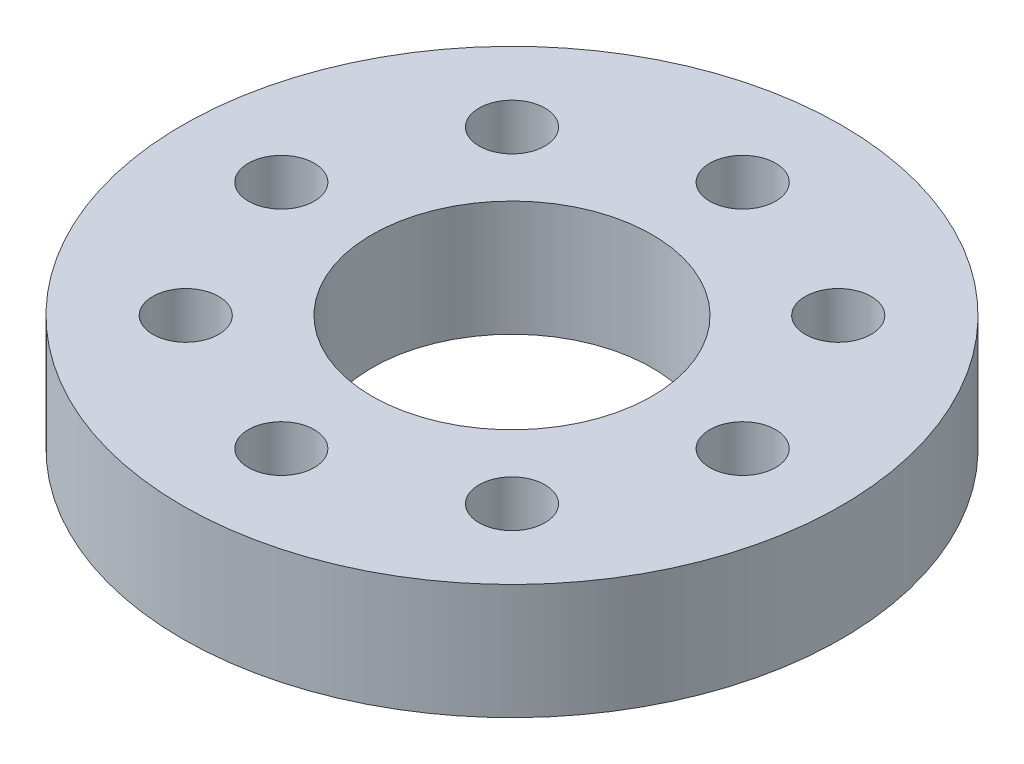
ISO-10303-21;
HEADER;
FILE_DESCRIPTION(('STEP AP214'),'2;1');
FILE_NAME('part.step','',(''),(''),'','','');
FILE_SCHEMA(('AUTOMOTIVE_DESIGN { 1 0 10303 214 1 1 1 1 }'));
ENDSEC;
DATA;
#1=APPLICATION_CONTEXT('core data for automotive mechanical design processes');
#2=APPLICATION_PROTOCOL_DEFINITION('international standard','automotive_design',2000,#1);
#3=PRODUCT_CONTEXT('',#1,'mechanical');
#4=PRODUCT('Part','Part','',(#3));
#5=PRODUCT_RELATED_PRODUCT_CATEGORY('part','',(#4));
#6=PRODUCT_DEFINITION_FORMATION('','',#4);
#7=PRODUCT_DEFINITION_CONTEXT('part definition',#1,'design');
#8=PRODUCT_DEFINITION('design','',#6,#7);
#9=PRODUCT_DEFINITION_SHAPE('','',#8);
#10=(LENGTH_UNIT() NAMED_UNIT(*) SI_UNIT(.MILLI.,.METRE.));
#11=(NAMED_UNIT(*) PLANE_ANGLE_UNIT() SI_UNIT($,.RADIAN.));
#12=(NAMED_UNIT(*) SI_UNIT($,.STERADIAN.) SOLID_ANGLE_UNIT());
#13=UNCERTAINTY_MEASURE_WITH_UNIT(LENGTH_MEASURE(1.E-05),#10,'distance_accuracy_value','');
#14=(GEOMETRIC_REPRESENTATION_CONTEXT(3) GLOBAL_UNCERTAINTY_ASSIGNED_CONTEXT((#13)) GLOBAL_UNIT_ASSIGNED_CONTEXT((#10,
#11,#12)) REPRESENTATION_CONTEXT('',''));
#15=CARTESIAN_POINT('',(0.,0.,0.));
#16=DIRECTION('',(0.,0.,1.));
#17=DIRECTION('',(1.,0.,0.));
#18=AXIS2_PLACEMENT_3D('',#15,#16,#17);
#19=CARTESIAN_POINT('',(0.,3.5,0.));
#20=DIRECTION('',(0.,1.,0.));
#21=DIRECTION('',(0.,0.,1.));
#22=AXIS2_PLACEMENT_3D('',#19,#20,#21);
#23=PLANE('',#22);
#24=CARTESIAN_POINT('',(-7.,3.5,0.));
#25=DIRECTION('',(0.,1.,0.));
#26=DIRECTION('',(0.,0.,1.));
#27=AXIS2_PLACEMENT_3D('',#24,#25,#26);
#28=CIRCLE('',#27,1.00000000000007);
#29=CARTESIAN_POINT('',(-7.,3.5,1.00000000000007));
#30=VERTEX_POINT('',#29);
#31=EDGE_CURVE('E86',#30,#30,#28,.T.);
#32=ORIENTED_EDGE('',*,*,#31,.F.);
#33=EDGE_LOOP('',(#32));
#34=FACE_BOUND('',#33,.T.);
#35=CARTESIAN_POINT('',(0.,3.5,7.));
#36=DIRECTION('',(0.,1.,0.));
#37=DIRECTION('',(0.,0.,1.));
#38=AXIS2_PLACEMENT_3D('',#35,#36,#37);
#39=CIRCLE('',#38,1.00000000000005);
#40=CARTESIAN_POINT('',(0.,3.5,8.00000000000005));
#41=VERTEX_POINT('',#40);
#42=EDGE_CURVE('E74',#41,#41,#39,.T.);
#43=ORIENTED_EDGE('',*,*,#42,.F.);
#44=EDGE_LOOP('',(#43));
#45=FACE_BOUND('',#44,.T.);
#46=CARTESIAN_POINT('',(7.,3.5,0.));
#47=DIRECTION('',(0.,1.,0.));
#48=DIRECTION('',(0.,0.,1.));
#49=AXIS2_PLACEMENT_3D('',#46,#47,#48);
#50=CIRCLE('',#49,1.00000000000002);
#51=CARTESIAN_POINT('',(7.,3.5,1.00000000000002));
#52=VERTEX_POINT('',#51);
#53=EDGE_CURVE('E62',#52,#52,#50,.T.);
#54=ORIENTED_EDGE('',*,*,#53,.F.);
#55=EDGE_LOOP('',(#54));
#56=FACE_BOUND('',#55,.T.);
#57=CARTESIAN_POINT('',(0.,3.5,-7.));
#58=DIRECTION('',(0.,1.,0.));
#59=DIRECTION('',(0.,0.,1.));
#60=AXIS2_PLACEMENT_3D('',#57,#58,#59);
#61=CIRCLE('',#60,1.);
#62=CARTESIAN_POINT('',(0.,3.5,-6.));
#63=VERTEX_POINT('',#62);
#64=EDGE_CURVE('E50',#63,#63,#61,.T.);
#65=ORIENTED_EDGE('',*,*,#64,.F.);
#66=EDGE_LOOP('',(#65));
#67=FACE_BOUND('',#66,.T.);
#68=CARTESIAN_POINT('',(0.,3.5,0.));
#69=DIRECTION('',(0.,1.,0.));
#70=DIRECTION('',(0.,0.,1.));
#71=AXIS2_PLACEMENT_3D('',#68,#69,#70);
#72=CIRCLE('',#71,10.);
#73=CARTESIAN_POINT('',(0.,3.5,10.));
#74=VERTEX_POINT('',#73);
#75=EDGE_CURVE('E10',#74,#74,#72,.T.);
#76=ORIENTED_EDGE('',*,*,#75,.T.);
#77=EDGE_LOOP('',(#76));
#78=FACE_BOUND('',#77,.T.);
#79=CARTESIAN_POINT('',(0.,3.5,0.));
#80=DIRECTION('',(0.,1.,0.));
#81=DIRECTION('',(0.,0.,1.));
#82=AXIS2_PLACEMENT_3D('',#79,#80,#81);
#83=CIRCLE('',#82,4.25);
#84=CARTESIAN_POINT('',(0.,3.5,4.25));
#85=VERTEX_POINT('',#84);
#86=EDGE_CURVE('E45',#85,#85,#83,.T.);
#87=ORIENTED_EDGE('',*,*,#86,.F.);
#88=EDGE_LOOP('',(#87));
#89=FACE_BOUND('',#88,.T.);
#90=CARTESIAN_POINT('',(4.94974746830583,3.5,-4.94974746830583));
#91=DIRECTION('',(0.,1.,0.));
#92=DIRECTION('',(0.,0.,1.));
#93=AXIS2_PLACEMENT_3D('',#90,#91,#92);
#94=CIRCLE('',#93,1.00000000000001);
#95=CARTESIAN_POINT('',(4.94974746830583,3.5,-3.94974746830582));
#96=VERTEX_POINT('',#95);
#97=EDGE_CURVE('E56',#96,#96,#94,.T.);
#98=ORIENTED_EDGE('',*,*,#97,.F.);
#99=EDGE_LOOP('',(#98));
#100=FACE_BOUND('',#99,.T.);
#101=CARTESIAN_POINT('',(4.94974746830583,3.5,4.94974746830583));
#102=DIRECTION('',(0.,1.,0.));
#103=DIRECTION('',(0.,0.,1.));
#104=AXIS2_PLACEMENT_3D('',#101,#102,#103);
#105=CIRCLE('',#104,1.00000000000003);
#106=CARTESIAN_POINT('',(4.94974746830583,3.5,5.94974746830587));
#107=VERTEX_POINT('',#106);
#108=EDGE_CURVE('E68',#107,#107,#105,.T.);
#109=ORIENTED_EDGE('',*,*,#108,.F.);
#110=EDGE_LOOP('',(#109));
#111=FACE_BOUND('',#110,.T.);
#112=CARTESIAN_POINT('',(-4.94974746830583,3.5,4.94974746830583));
#113=DIRECTION('',(0.,1.,0.));
#114=DIRECTION('',(0.,0.,1.));
#115=AXIS2_PLACEMENT_3D('',#112,#113,#114);
#116=CIRCLE('',#115,1.00000000000006);
#117=CARTESIAN_POINT('',(-4.94974746830583,3.5,5.94974746830589));
#118=VERTEX_POINT('',#117);
#119=EDGE_CURVE('E80',#118,#118,#116,.T.);
#120=ORIENTED_EDGE('',*,*,#119,.F.);
#121=EDGE_LOOP('',(#120));
#122=FACE_BOUND('',#121,.T.);
#123=CARTESIAN_POINT('',(-4.94974746830583,3.5,-4.94974746830583));
#124=DIRECTION('',(0.,1.,0.));
#125=DIRECTION('',(0.,0.,1.));
#126=AXIS2_PLACEMENT_3D('',#123,#124,#125);
#127=CIRCLE('',#126,1.00000000000008);
#128=CARTESIAN_POINT('',(-4.94974746830583,3.5,-3.94974746830575));
#129=VERTEX_POINT('',#128);
#130=EDGE_CURVE('E92',#129,#129,#127,.T.);
#131=ORIENTED_EDGE('',*,*,#130,.F.);
#132=EDGE_LOOP('',(#131));
#133=FACE_BOUND('',#132,.T.);
#134=ADVANCED_FACE('F34',(#34,#45,#56,#67,#78,#89,#100,#111,#122,#133),#23,.T.);
#135=CARTESIAN_POINT('',(0.,0.,0.));
#136=DIRECTION('',(0.,1.,0.));
#137=DIRECTION('',(0.,0.,1.));
#138=AXIS2_PLACEMENT_3D('',#135,#136,#137);
#139=PLANE('',#138);
#140=CARTESIAN_POINT('',(0.,0.,0.));
#141=DIRECTION('',(0.,1.,0.));
#142=DIRECTION('',(0.,0.,1.));
#143=AXIS2_PLACEMENT_3D('',#140,#141,#142);
#144=CIRCLE('',#143,10.);
#145=CARTESIAN_POINT('',(0.,0.,10.));
#146=VERTEX_POINT('',#145);
#147=EDGE_CURVE('E38',#146,#146,#144,.T.);
#148=ORIENTED_EDGE('',*,*,#147,.F.);
#149=EDGE_LOOP('',(#148));
#150=FACE_BOUND('',#149,.T.);
#151=CARTESIAN_POINT('',(0.,0.,0.));
#152=DIRECTION('',(0.,1.,0.));
#153=DIRECTION('',(0.,0.,1.));
#154=AXIS2_PLACEMENT_3D('',#151,#152,#153);
#155=CIRCLE('',#154,4.25);
#156=CARTESIAN_POINT('',(0.,0.,4.25));
#157=VERTEX_POINT('',#156);
#158=EDGE_CURVE('E47',#157,#157,#155,.T.);
#159=ORIENTED_EDGE('',*,*,#158,.T.);
#160=EDGE_LOOP('',(#159));
#161=FACE_BOUND('',#160,.T.);
#162=CARTESIAN_POINT('',(0.,0.,-7.));
#163=DIRECTION('',(0.,1.,0.));
#164=DIRECTION('',(0.,0.,1.));
#165=AXIS2_PLACEMENT_3D('',#162,#163,#164);
#166=CIRCLE('',#165,1.);
#167=CARTESIAN_POINT('',(0.,0.,-6.));
#168=VERTEX_POINT('',#167);
#169=EDGE_CURVE('E53',#168,#168,#166,.T.);
#170=ORIENTED_EDGE('',*,*,#169,.T.);
#171=EDGE_LOOP('',(#170));
#172=FACE_BOUND('',#171,.T.);
#173=CARTESIAN_POINT('',(4.94974746830583,0.,-4.94974746830583));
#174=DIRECTION('',(0.,1.,0.));
#175=DIRECTION('',(0.,0.,1.));
#176=AXIS2_PLACEMENT_3D('',#173,#174,#175);
#177=CIRCLE('',#176,1.00000000000001);
#178=CARTESIAN_POINT('',(4.94974746830583,0.,-3.94974746830582));
#179=VERTEX_POINT('',#178);
#180=EDGE_CURVE('E59',#179,#179,#177,.T.);
#181=ORIENTED_EDGE('',*,*,#180,.T.);
#182=EDGE_LOOP('',(#181));
#183=FACE_BOUND('',#182,.T.);
#184=CARTESIAN_POINT('',(7.,0.,0.));
#185=DIRECTION('',(0.,1.,0.));
#186=DIRECTION('',(0.,0.,1.));
#187=AXIS2_PLACEMENT_3D('',#184,#185,#186);
#188=CIRCLE('',#187,1.00000000000002);
#189=CARTESIAN_POINT('',(7.,0.,1.00000000000002));
#190=VERTEX_POINT('',#189);
#191=EDGE_CURVE('E65',#190,#190,#188,.T.);
#192=ORIENTED_EDGE('',*,*,#191,.T.);
#193=EDGE_LOOP('',(#192));
#194=FACE_BOUND('',#193,.T.);
#195=CARTESIAN_POINT('',(4.94974746830583,0.,4.94974746830583));
#196=DIRECTION('',(0.,1.,0.));
#197=DIRECTION('',(0.,0.,1.));
#198=AXIS2_PLACEMENT_3D('',#195,#196,#197);
#199=CIRCLE('',#198,1.00000000000003);
#200=CARTESIAN_POINT('',(4.94974746830583,0.,5.94974746830587));
#201=VERTEX_POINT('',#200);
#202=EDGE_CURVE('E71',#201,#201,#199,.T.);
#203=ORIENTED_EDGE('',*,*,#202,.T.);
#204=EDGE_LOOP('',(#203));
#205=FACE_BOUND('',#204,.T.);
#206=CARTESIAN_POINT('',(0.,0.,7.));
#207=DIRECTION('',(0.,1.,0.));
#208=DIRECTION('',(0.,0.,1.));
#209=AXIS2_PLACEMENT_3D('',#206,#207,#208);
#210=CIRCLE('',#209,1.00000000000005);
#211=CARTESIAN_POINT('',(0.,0.,8.00000000000005));
#212=VERTEX_POINT('',#211);
#213=EDGE_CURVE('E77',#212,#212,#210,.T.);
#214=ORIENTED_EDGE('',*,*,#213,.T.);
#215=EDGE_LOOP('',(#214));
#216=FACE_BOUND('',#215,.T.);
#217=CARTESIAN_POINT('',(-4.94974746830583,0.,4.94974746830583));
#218=DIRECTION('',(0.,1.,0.));
#219=DIRECTION('',(0.,0.,1.));
#220=AXIS2_PLACEMENT_3D('',#217,#218,#219);
#221=CIRCLE('',#220,1.00000000000006);
#222=CARTESIAN_POINT('',(-4.94974746830583,0.,5.94974746830589));
#223=VERTEX_POINT('',#222);
#224=EDGE_CURVE('E83',#223,#223,#221,.T.);
#225=ORIENTED_EDGE('',*,*,#224,.T.);
#226=EDGE_LOOP('',(#225));
#227=FACE_BOUND('',#226,.T.);
#228=CARTESIAN_POINT('',(-7.,0.,0.));
#229=DIRECTION('',(0.,1.,0.));
#230=DIRECTION('',(0.,0.,1.));
#231=AXIS2_PLACEMENT_3D('',#228,#229,#230);
#232=CIRCLE('',#231,1.00000000000007);
#233=CARTESIAN_POINT('',(-7.,0.,1.00000000000007));
#234=VERTEX_POINT('',#233);
#235=EDGE_CURVE('E89',#234,#234,#232,.T.);
#236=ORIENTED_EDGE('',*,*,#235,.T.);
#237=EDGE_LOOP('',(#236));
#238=FACE_BOUND('',#237,.T.);
#239=CARTESIAN_POINT('',(-4.94974746830583,0.,-4.94974746830583));
#240=DIRECTION('',(0.,1.,0.));
#241=DIRECTION('',(0.,0.,1.));
#242=AXIS2_PLACEMENT_3D('',#239,#240,#241);
#243=CIRCLE('',#242,1.00000000000008);
#244=CARTESIAN_POINT('',(-4.94974746830583,0.,-3.94974746830575));
#245=VERTEX_POINT('',#244);
#246=EDGE_CURVE('E95',#245,#245,#243,.T.);
#247=ORIENTED_EDGE('',*,*,#246,.T.);
#248=EDGE_LOOP('',(#247));
#249=FACE_BOUND('',#248,.T.);
#250=ADVANCED_FACE('F105',(#150,#161,#172,#183,#194,#205,#216,#227,#238,#249),#139,.F.);
#251=CARTESIAN_POINT('',(0.,3.5,0.));
#252=DIRECTION('',(0.,-1.,0.));
#253=DIRECTION('',(0.,0.,-1.));
#254=AXIS2_PLACEMENT_3D('',#251,#252,#253);
#255=CYLINDRICAL_SURFACE('',#254,10.);
#256=ORIENTED_EDGE('',*,*,#75,.F.);
#257=EDGE_LOOP('',(#256));
#258=FACE_BOUND('',#257,.T.);
#259=ORIENTED_EDGE('',*,*,#147,.T.);
#260=EDGE_LOOP('',(#259));
#261=FACE_BOUND('',#260,.T.);
#262=ADVANCED_FACE('F36',(#258,#261),#255,.T.);
#263=CARTESIAN_POINT('',(0.,3.5,0.));
#264=DIRECTION('',(0.,-1.,0.));
#265=DIRECTION('',(0.,0.,-1.));
#266=AXIS2_PLACEMENT_3D('',#263,#264,#265);
#267=CYLINDRICAL_SURFACE('',#266,4.25);
#268=ORIENTED_EDGE('',*,*,#86,.T.);
#269=EDGE_LOOP('',(#268));
#270=FACE_BOUND('',#269,.T.);
#271=ORIENTED_EDGE('',*,*,#158,.F.);
#272=EDGE_LOOP('',(#271));
#273=FACE_BOUND('',#272,.T.);
#274=ADVANCED_FACE('F115',(#270,#273),#267,.F.);
#275=CARTESIAN_POINT('',(0.,3.5,-7.));
#276=DIRECTION('',(0.,-1.,0.));
#277=DIRECTION('',(0.,0.,-1.));
#278=AXIS2_PLACEMENT_3D('',#275,#276,#277);
#279=CYLINDRICAL_SURFACE('',#278,1.);
#280=ORIENTED_EDGE('',*,*,#64,.T.);
#281=EDGE_LOOP('',(#280));
#282=FACE_BOUND('',#281,.T.);
#283=ORIENTED_EDGE('',*,*,#169,.F.);
#284=EDGE_LOOP('',(#283));
#285=FACE_BOUND('',#284,.T.);
#286=ADVANCED_FACE('F118',(#282,#285),#279,.F.);
#287=CARTESIAN_POINT('',(4.94974746830583,3.5,-4.94974746830583));
#288=DIRECTION('',(0.,-1.,0.));
#289=DIRECTION('',(0.,0.,-1.));
#290=AXIS2_PLACEMENT_3D('',#287,#288,#289);
#291=CYLINDRICAL_SURFACE('',#290,1.00000000000001);
#292=ORIENTED_EDGE('',*,*,#97,.T.);
#293=EDGE_LOOP('',(#292));
#294=FACE_BOUND('',#293,.T.);
#295=ORIENTED_EDGE('',*,*,#180,.F.);
#296=EDGE_LOOP('',(#295));
#297=FACE_BOUND('',#296,.T.);
#298=ADVANCED_FACE('F122',(#294,#297),#291,.F.);
#299=CARTESIAN_POINT('',(7.,3.5,0.));
#300=DIRECTION('',(0.,-1.,0.));
#301=DIRECTION('',(0.,0.,-1.));
#302=AXIS2_PLACEMENT_3D('',#299,#300,#301);
#303=CYLINDRICAL_SURFACE('',#302,1.00000000000002);
#304=ORIENTED_EDGE('',*,*,#53,.T.);
#305=EDGE_LOOP('',(#304));
#306=FACE_BOUND('',#305,.T.);
#307=ORIENTED_EDGE('',*,*,#191,.F.);
#308=EDGE_LOOP('',(#307));
#309=FACE_BOUND('',#308,.T.);
#310=ADVANCED_FACE('F126',(#306,#309),#303,.F.);
#311=CARTESIAN_POINT('',(4.94974746830583,3.5,4.94974746830583));
#312=DIRECTION('',(0.,-1.,0.));
#313=DIRECTION('',(0.,0.,-1.));
#314=AXIS2_PLACEMENT_3D('',#311,#312,#313);
#315=CYLINDRICAL_SURFACE('',#314,1.00000000000003);
#316=ORIENTED_EDGE('',*,*,#108,.T.);
#317=EDGE_LOOP('',(#316));
#318=FACE_BOUND('',#317,.T.);
#319=ORIENTED_EDGE('',*,*,#202,.F.);
#320=EDGE_LOOP('',(#319));
#321=FACE_BOUND('',#320,.T.);
#322=ADVANCED_FACE('F130',(#318,#321),#315,.F.);
#323=CARTESIAN_POINT('',(0.,3.5,7.));
#324=DIRECTION('',(0.,-1.,0.));
#325=DIRECTION('',(0.,0.,-1.));
#326=AXIS2_PLACEMENT_3D('',#323,#324,#325);
#327=CYLINDRICAL_SURFACE('',#326,1.00000000000005);
#328=ORIENTED_EDGE('',*,*,#42,.T.);
#329=EDGE_LOOP('',(#328));
#330=FACE_BOUND('',#329,.T.);
#331=ORIENTED_EDGE('',*,*,#213,.F.);
#332=EDGE_LOOP('',(#331));
#333=FACE_BOUND('',#332,.T.);
#334=ADVANCED_FACE('F134',(#330,#333),#327,.F.);
#335=CARTESIAN_POINT('',(-4.94974746830583,3.5,4.94974746830583));
#336=DIRECTION('',(0.,-1.,0.));
#337=DIRECTION('',(0.,0.,-1.));
#338=AXIS2_PLACEMENT_3D('',#335,#336,#337);
#339=CYLINDRICAL_SURFACE('',#338,1.00000000000006);
#340=ORIENTED_EDGE('',*,*,#119,.T.);
#341=EDGE_LOOP('',(#340));
#342=FACE_BOUND('',#341,.T.);
#343=ORIENTED_EDGE('',*,*,#224,.F.);
#344=EDGE_LOOP('',(#343));
#345=FACE_BOUND('',#344,.T.);
#346=ADVANCED_FACE('F138',(#342,#345),#339,.F.);
#347=CARTESIAN_POINT('',(-7.,3.5,0.));
#348=DIRECTION('',(0.,-1.,0.));
#349=DIRECTION('',(0.,0.,-1.));
#350=AXIS2_PLACEMENT_3D('',#347,#348,#349);
#351=CYLINDRICAL_SURFACE('',#350,1.00000000000007);
#352=ORIENTED_EDGE('',*,*,#31,.T.);
#353=EDGE_LOOP('',(#352));
#354=FACE_BOUND('',#353,.T.);
#355=ORIENTED_EDGE('',*,*,#235,.F.);
#356=EDGE_LOOP('',(#355));
#357=FACE_BOUND('',#356,.T.);
#358=ADVANCED_FACE('F142',(#354,#357),#351,.F.);
#359=CARTESIAN_POINT('',(-4.94974746830583,3.5,-4.94974746830583));
#360=DIRECTION('',(0.,-1.,0.));
#361=DIRECTION('',(0.,0.,-1.));
#362=AXIS2_PLACEMENT_3D('',#359,#360,#361);
#363=CYLINDRICAL_SURFACE('',#362,1.00000000000008);
#364=ORIENTED_EDGE('',*,*,#130,.T.);
#365=EDGE_LOOP('',(#364));
#366=FACE_BOUND('',#365,.T.);
#367=ORIENTED_EDGE('',*,*,#246,.F.);
#368=EDGE_LOOP('',(#367));
#369=FACE_BOUND('',#368,.T.);
#370=ADVANCED_FACE('F101',(#366,#369),#363,.F.);
#371=CLOSED_SHELL('',(#134,#250,#262,#274,#286,#298,#310,#322,#334,#346,#358,#370));
#372=MANIFOLD_SOLID_BREP('B2',#371);
#373=ADVANCED_BREP_SHAPE_REPRESENTATION('',(#18,#372),#14);
#374=SHAPE_DEFINITION_REPRESENTATION(#9,#373);
ENDSEC;
END-ISO-10303-21;
